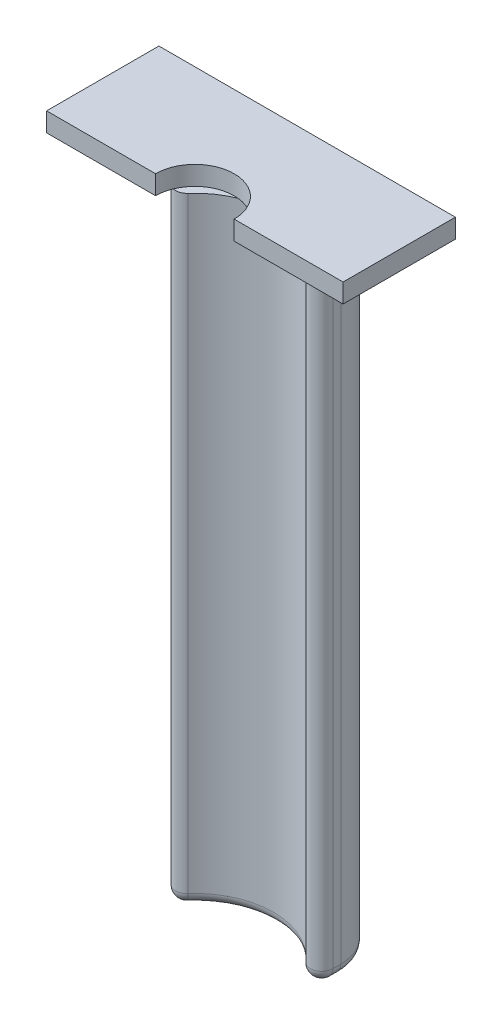
ISO-10303-21;
HEADER;
FILE_DESCRIPTION(('STEP AP214'),'2;1');
FILE_NAME('part.step','',(''),(''),'','','');
FILE_SCHEMA(('AUTOMOTIVE_DESIGN { 1 0 10303 214 1 1 1 1 }'));
ENDSEC;
DATA;
#1=APPLICATION_CONTEXT('core data for automotive mechanical design processes');
#2=APPLICATION_PROTOCOL_DEFINITION('international standard','automotive_design',2000,#1);
#3=PRODUCT_CONTEXT('',#1,'mechanical');
#4=PRODUCT('Part','Part','',(#3));
#5=PRODUCT_RELATED_PRODUCT_CATEGORY('part','',(#4));
#6=PRODUCT_DEFINITION_FORMATION('','',#4);
#7=PRODUCT_DEFINITION_CONTEXT('part definition',#1,'design');
#8=PRODUCT_DEFINITION('design','',#6,#7);
#9=PRODUCT_DEFINITION_SHAPE('','',#8);
#10=(LENGTH_UNIT() NAMED_UNIT(*) SI_UNIT(.MILLI.,.METRE.));
#11=(NAMED_UNIT(*) PLANE_ANGLE_UNIT() SI_UNIT($,.RADIAN.));
#12=(NAMED_UNIT(*) SI_UNIT($,.STERADIAN.) SOLID_ANGLE_UNIT());
#13=UNCERTAINTY_MEASURE_WITH_UNIT(LENGTH_MEASURE(1.E-05),#10,'distance_accuracy_value','');
#14=(GEOMETRIC_REPRESENTATION_CONTEXT(3) GLOBAL_UNCERTAINTY_ASSIGNED_CONTEXT((#13)) GLOBAL_UNIT_ASSIGNED_CONTEXT((#10,
#11,#12)) REPRESENTATION_CONTEXT('',''));
#15=CARTESIAN_POINT('',(0.,0.,0.));
#16=DIRECTION('',(0.,0.,1.));
#17=DIRECTION('',(1.,0.,0.));
#18=AXIS2_PLACEMENT_3D('',#15,#16,#17);
#19=CARTESIAN_POINT('',(0.,0.,10.));
#20=DIRECTION('',(0.,0.,-1.));
#21=DIRECTION('',(-1.,0.,0.));
#22=AXIS2_PLACEMENT_3D('',#19,#20,#21);
#23=PLANE('',#22);
#24=DIRECTION('',(1.,0.,0.));
#25=VECTOR('',#24,1.);
#26=CARTESIAN_POINT('',(0.,0.,10.));
#27=LINE('',#26,#25);
#28=CARTESIAN_POINT('',(0.,0.,10.));
#29=VERTEX_POINT('',#28);
#30=CARTESIAN_POINT('',(9.7,0.,10.));
#31=VERTEX_POINT('',#30);
#32=EDGE_CURVE('E509',#29,#31,#27,.T.);
#33=ORIENTED_EDGE('',*,*,#32,.T.);
#34=DIRECTION('',(0.,1.,0.));
#35=VECTOR('',#34,1.);
#36=CARTESIAN_POINT('',(9.7,-58.,10.));
#37=LINE('',#36,#35);
#38=CARTESIAN_POINT('',(9.7,1.7,10.));
#39=VERTEX_POINT('',#38);
#40=EDGE_CURVE('E11',#31,#39,#37,.T.);
#41=ORIENTED_EDGE('',*,*,#40,.T.);
#42=DIRECTION('',(-1.,0.,0.));
#43=VECTOR('',#42,1.);
#44=CARTESIAN_POINT('',(0.,1.7,10.));
#45=LINE('',#44,#43);
#46=CARTESIAN_POINT('',(0.,1.7,10.));
#47=VERTEX_POINT('',#46);
#48=EDGE_CURVE('E198',#39,#47,#45,.T.);
#49=ORIENTED_EDGE('',*,*,#48,.T.);
#50=DIRECTION('',(0.,-1.,0.));
#51=VECTOR('',#50,1.);
#52=CARTESIAN_POINT('',(0.,0.,10.));
#53=LINE('',#52,#51);
#54=EDGE_CURVE('E231',#47,#29,#53,.T.);
#55=ORIENTED_EDGE('',*,*,#54,.T.);
#56=EDGE_LOOP('',(#33,#41,#49,#55));
#57=FACE_BOUND('',#56,.T.);
#58=ADVANCED_FACE('F40',(#57),#23,.F.);
#59=CARTESIAN_POINT('',(0.,0.,10.));
#60=DIRECTION('',(0.,1.,0.));
#61=DIRECTION('',(0.,0.,1.));
#62=AXIS2_PLACEMENT_3D('',#59,#60,#61);
#63=PLANE('',#62);
#64=CARTESIAN_POINT('',(16.7,0.,10.));
#65=VERTEX_POINT('',#64);
#66=CARTESIAN_POINT('',(26.4,0.,10.));
#67=VERTEX_POINT('',#66);
#68=EDGE_CURVE('E508',#65,#67,#27,.T.);
#69=ORIENTED_EDGE('',*,*,#68,.F.);
#70=CARTESIAN_POINT('',(13.2,0.,10.));
#71=DIRECTION('',(0.,1.,0.));
#72=DIRECTION('',(0.,0.,1.));
#73=AXIS2_PLACEMENT_3D('',#70,#71,#72);
#74=CIRCLE('',#73,3.5);
#75=EDGE_CURVE('E56',#65,#31,#74,.T.);
#76=ORIENTED_EDGE('',*,*,#75,.T.);
#77=ORIENTED_EDGE('',*,*,#32,.F.);
#78=DIRECTION('',(0.,0.,-1.));
#79=VECTOR('',#78,1.);
#80=CARTESIAN_POINT('',(0.,0.,10.));
#81=LINE('',#80,#79);
#82=CARTESIAN_POINT('',(0.,0.,0.));
#83=VERTEX_POINT('',#82);
#84=EDGE_CURVE('E239',#29,#83,#81,.T.);
#85=ORIENTED_EDGE('',*,*,#84,.T.);
#86=DIRECTION('',(1.,0.,0.));
#87=VECTOR('',#86,1.);
#88=CARTESIAN_POINT('',(0.,0.,0.));
#89=LINE('',#88,#87);
#90=CARTESIAN_POINT('',(3.27179676972449,0.,0.));
#91=VERTEX_POINT('',#90);
#92=EDGE_CURVE('E222',#83,#91,#89,.T.);
#93=ORIENTED_EDGE('',*,*,#92,.T.);
#94=CARTESIAN_POINT('',(10.2,0.,4.));
#95=DIRECTION('',(0.,1.,0.));
#96=DIRECTION('',(0.,0.,1.));
#97=AXIS2_PLACEMENT_3D('',#94,#95,#96);
#98=CIRCLE('',#97,8.);
#99=CARTESIAN_POINT('',(2.78379079597067,0.,1.0000264931052));
#100=VERTEX_POINT('',#99);
#101=EDGE_CURVE('E277',#91,#100,#98,.T.);
#102=ORIENTED_EDGE('',*,*,#101,.T.);
#103=DIRECTION('',(-1.,0.,0.));
#104=VECTOR('',#103,1.);
#105=CARTESIAN_POINT('',(6.2,0.,1.0000264931052));
#106=LINE('',#105,#104);
#107=CARTESIAN_POINT('',(23.6162092040293,0.,1.0000264931052));
#108=VERTEX_POINT('',#107);
#109=EDGE_CURVE('E501',#108,#100,#106,.T.);
#110=ORIENTED_EDGE('',*,*,#109,.F.);
#111=CARTESIAN_POINT('',(16.2,0.,4.));
#112=DIRECTION('',(0.,1.,0.));
#113=DIRECTION('',(0.,0.,1.));
#114=AXIS2_PLACEMENT_3D('',#111,#112,#113);
#115=CIRCLE('',#114,8.);
#116=CARTESIAN_POINT('',(23.1282032302755,0.,0.));
#117=VERTEX_POINT('',#116);
#118=EDGE_CURVE('E281',#108,#117,#115,.T.);
#119=ORIENTED_EDGE('',*,*,#118,.T.);
#120=CARTESIAN_POINT('',(26.4,0.,0.));
#121=VERTEX_POINT('',#120);
#122=EDGE_CURVE('E220',#117,#121,#89,.T.);
#123=ORIENTED_EDGE('',*,*,#122,.T.);
#124=DIRECTION('',(0.,0.,-1.));
#125=VECTOR('',#124,1.);
#126=CARTESIAN_POINT('',(26.4,0.,10.));
#127=LINE('',#126,#125);
#128=EDGE_CURVE('E235',#67,#121,#127,.T.);
#129=ORIENTED_EDGE('',*,*,#128,.F.);
#130=EDGE_LOOP('',(#69,#76,#77,#85,#93,#102,#110,#119,#123,#129));
#131=FACE_BOUND('',#130,.T.);
#132=ADVANCED_FACE('F384',(#131),#63,.F.);
#133=CARTESIAN_POINT('',(0.,0.,10.));
#134=DIRECTION('',(1.,0.,0.));
#135=DIRECTION('',(0.,0.,-1.));
#136=AXIS2_PLACEMENT_3D('',#133,#134,#135);
#137=PLANE('',#136);
#138=DIRECTION('',(0.,-1.,0.));
#139=VECTOR('',#138,1.);
#140=CARTESIAN_POINT('',(0.,0.,0.));
#141=LINE('',#140,#139);
#142=CARTESIAN_POINT('',(0.,1.7,0.));
#143=VERTEX_POINT('',#142);
#144=EDGE_CURVE('E216',#143,#83,#141,.T.);
#145=ORIENTED_EDGE('',*,*,#144,.T.);
#146=ORIENTED_EDGE('',*,*,#84,.F.);
#147=ORIENTED_EDGE('',*,*,#54,.F.);
#148=DIRECTION('',(0.,0.,-1.));
#149=VECTOR('',#148,1.);
#150=CARTESIAN_POINT('',(0.,1.7,10.));
#151=LINE('',#150,#149);
#152=EDGE_CURVE('E206',#47,#143,#151,.T.);
#153=ORIENTED_EDGE('',*,*,#152,.T.);
#154=EDGE_LOOP('',(#145,#146,#147,#153));
#155=FACE_BOUND('',#154,.T.);
#156=ADVANCED_FACE('F390',(#155),#137,.F.);
#157=CARTESIAN_POINT('',(26.4,0.,10.));
#158=DIRECTION('',(-1.,0.,0.));
#159=DIRECTION('',(0.,0.,1.));
#160=AXIS2_PLACEMENT_3D('',#157,#158,#159);
#161=PLANE('',#160);
#162=DIRECTION('',(0.,1.,0.));
#163=VECTOR('',#162,1.);
#164=CARTESIAN_POINT('',(26.4,0.,0.));
#165=LINE('',#164,#163);
#166=CARTESIAN_POINT('',(26.4,1.7,0.));
#167=VERTEX_POINT('',#166);
#168=EDGE_CURVE('E226',#121,#167,#165,.T.);
#169=ORIENTED_EDGE('',*,*,#168,.T.);
#170=DIRECTION('',(0.,0.,-1.));
#171=VECTOR('',#170,1.);
#172=CARTESIAN_POINT('',(26.4,1.7,10.));
#173=LINE('',#172,#171);
#174=CARTESIAN_POINT('',(26.4,1.7,10.));
#175=VERTEX_POINT('',#174);
#176=EDGE_CURVE('E211',#175,#167,#173,.T.);
#177=ORIENTED_EDGE('',*,*,#176,.F.);
#178=DIRECTION('',(0.,1.,0.));
#179=VECTOR('',#178,1.);
#180=CARTESIAN_POINT('',(26.4,0.,10.));
#181=LINE('',#180,#179);
#182=EDGE_CURVE('E203',#67,#175,#181,.T.);
#183=ORIENTED_EDGE('',*,*,#182,.F.);
#184=ORIENTED_EDGE('',*,*,#128,.T.);
#185=EDGE_LOOP('',(#169,#177,#183,#184));
#186=FACE_BOUND('',#185,.T.);
#187=ADVANCED_FACE('F399',(#186),#161,.F.);
#188=CARTESIAN_POINT('',(0.,1.7,10.));
#189=DIRECTION('',(0.,-1.,0.));
#190=DIRECTION('',(0.,0.,-1.));
#191=AXIS2_PLACEMENT_3D('',#188,#189,#190);
#192=PLANE('',#191);
#193=ORIENTED_EDGE('',*,*,#48,.F.);
#194=CARTESIAN_POINT('',(13.2,1.7,10.));
#195=DIRECTION('',(0.,1.,0.));
#196=DIRECTION('',(0.,0.,1.));
#197=AXIS2_PLACEMENT_3D('',#194,#195,#196);
#198=CIRCLE('',#197,3.5);
#199=CARTESIAN_POINT('',(16.7,1.7,10.));
#200=VERTEX_POINT('',#199);
#201=EDGE_CURVE('E185',#200,#39,#198,.T.);
#202=ORIENTED_EDGE('',*,*,#201,.F.);
#203=EDGE_CURVE('E196',#175,#200,#45,.T.);
#204=ORIENTED_EDGE('',*,*,#203,.F.);
#205=ORIENTED_EDGE('',*,*,#176,.T.);
#206=DIRECTION('',(-1.,0.,0.));
#207=VECTOR('',#206,1.);
#208=CARTESIAN_POINT('',(0.,1.7,0.));
#209=LINE('',#208,#207);
#210=EDGE_CURVE('E229',#167,#143,#209,.T.);
#211=ORIENTED_EDGE('',*,*,#210,.T.);
#212=ORIENTED_EDGE('',*,*,#152,.F.);
#213=EDGE_LOOP('',(#193,#202,#204,#205,#211,#212));
#214=FACE_BOUND('',#213,.T.);
#215=ADVANCED_FACE('F194',(#214),#192,.F.);
#216=ORIENTED_EDGE('',*,*,#203,.T.);
#217=DIRECTION('',(0.,1.,0.));
#218=VECTOR('',#217,1.);
#219=CARTESIAN_POINT('',(16.7,-58.,10.));
#220=LINE('',#219,#218);
#221=EDGE_CURVE('E49',#200,#65,#220,.F.);
#222=ORIENTED_EDGE('',*,*,#221,.T.);
#223=ORIENTED_EDGE('',*,*,#68,.T.);
#224=ORIENTED_EDGE('',*,*,#182,.T.);
#225=EDGE_LOOP('',(#216,#222,#223,#224));
#226=FACE_BOUND('',#225,.T.);
#227=ADVANCED_FACE('F201',(#226),#23,.F.);
#228=CARTESIAN_POINT('',(0.,0.,0.));
#229=DIRECTION('',(0.,0.,-1.));
#230=DIRECTION('',(-1.,0.,0.));
#231=AXIS2_PLACEMENT_3D('',#228,#229,#230);
#232=PLANE('',#231);
#233=DIRECTION('',(0.,1.,0.));
#234=VECTOR('',#233,1.);
#235=CARTESIAN_POINT('',(16.2,-58.,0.));
#236=LINE('',#235,#234);
#237=CARTESIAN_POINT('',(16.2,-4.,0.));
#238=VERTEX_POINT('',#237);
#239=CARTESIAN_POINT('',(16.2,-57.,0.));
#240=VERTEX_POINT('',#239);
#241=EDGE_CURVE('E270',#238,#240,#236,.F.);
#242=ORIENTED_EDGE('',*,*,#241,.T.);
#243=DIRECTION('',(1.,0.,0.));
#244=VECTOR('',#243,1.);
#245=CARTESIAN_POINT('',(0.,-57.,0.));
#246=LINE('',#245,#244);
#247=CARTESIAN_POINT('',(10.2,-57.,0.));
#248=VERTEX_POINT('',#247);
#249=EDGE_CURVE('E190',#240,#248,#246,.F.);
#250=ORIENTED_EDGE('',*,*,#249,.T.);
#251=DIRECTION('',(0.,1.,0.));
#252=VECTOR('',#251,1.);
#253=CARTESIAN_POINT('',(10.2,0.,0.));
#254=LINE('',#253,#252);
#255=CARTESIAN_POINT('',(10.2,-4.,0.));
#256=VERTEX_POINT('',#255);
#257=EDGE_CURVE('E267',#248,#256,#254,.T.);
#258=ORIENTED_EDGE('',*,*,#257,.T.);
#259=CARTESIAN_POINT('',(3.27179676972449,0.,0.));
#260=CARTESIAN_POINT('',(3.44318740382075,2.3757210775233E-05,0.));
#261=CARTESIAN_POINT('',(3.61447794935872,-0.0082578547366063,0.));
#262=CARTESIAN_POINT('',(3.95535815549959,-0.0402941713150807,0.));
#263=CARTESIAN_POINT('',(4.12495000635247,-0.0640253291150302,0.));
#264=CARTESIAN_POINT('',(4.45943389154686,-0.125457538262513,0.));
#265=CARTESIAN_POINT('',(4.62435793170057,-0.162986849639074,0.));
#266=CARTESIAN_POINT('',(4.95080234194004,-0.25087788643673,0.));
#267=CARTESIAN_POINT('',(5.11232104613848,-0.301245741670157,0.));
#268=CARTESIAN_POINT('',(5.49058875073115,-0.434512302334383,0.));
#269=CARTESIAN_POINT('',(5.70553536395276,-0.522542648624137,0.));
#270=CARTESIAN_POINT('',(6.12672082413843,-0.717349162369902,0.));
#271=CARTESIAN_POINT('',(6.33295700838357,-0.824131011312194,0.));
#272=CARTESIAN_POINT('',(6.73740431677205,-1.05393922273429,0.));
#273=CARTESIAN_POINT('',(6.93557241809557,-1.17704071935888,0.));
#274=CARTESIAN_POINT('',(7.32327058637973,-1.43625002558701,0.));
#275=CARTESIAN_POINT('',(7.51279664596624,-1.57236378027297,0.));
#276=CARTESIAN_POINT('',(8.14662058674845,-2.05483157478887,0.));
#277=CARTESIAN_POINT('',(8.57180901734936,-2.4260596530431,0.));
#278=CARTESIAN_POINT('',(9.39502283195022,-3.1951894009338,0.));
#279=CARTESIAN_POINT('',(9.79306897501043,-3.59307021352641,0.));
#280=CARTESIAN_POINT('',(10.1940371497967,-3.99403715178295,0.));
#281=CARTESIAN_POINT('',(10.1970185737604,-3.99701857576173,0.));
#282=CARTESIAN_POINT('',(10.2,-4.,0.));
#283=B_SPLINE_CURVE_WITH_KNOTS('',3,(#259,#260,#261,#262,#263,#264,#265,#266,#267,#268,#269,
#270,#271,#272,#273,#274,#275,#276,#277,#278,#279,#280,#281,#282),.UNSPECIFIED.,.F.,.F.,(4,2,2,
2,2,2,2,2,2,2,2,4),(0.,0.513825328055995,1.02686935660983,1.53373272415263,2.04083855036094,
2.73656004201664,3.43249269401187,4.13174848318381,4.83132529150025,6.5211454317345,
8.20965831535387,8.22230742599459),.UNSPECIFIED.);
#284=EDGE_CURVE('E324',#256,#91,#283,.F.);
#285=ORIENTED_EDGE('',*,*,#284,.T.);
#286=ORIENTED_EDGE('',*,*,#92,.F.);
#287=ORIENTED_EDGE('',*,*,#144,.F.);
#288=ORIENTED_EDGE('',*,*,#210,.F.);
#289=ORIENTED_EDGE('',*,*,#168,.F.);
#290=ORIENTED_EDGE('',*,*,#122,.F.);
#291=CARTESIAN_POINT('',(23.1282032302755,0.,0.));
#292=CARTESIAN_POINT('',(22.9568125961793,2.37572107752989E-05,0.));
#293=CARTESIAN_POINT('',(22.7855220506413,-0.00825785473660565,0.));
#294=CARTESIAN_POINT('',(22.4446418445004,-0.0402941713150781,0.));
#295=CARTESIAN_POINT('',(22.2750499936476,-0.0640253291150263,0.));
#296=CARTESIAN_POINT('',(21.9405661084532,-0.125457538262508,0.));
#297=CARTESIAN_POINT('',(21.7756420682995,-0.16298684963907,0.));
#298=CARTESIAN_POINT('',(21.44919765806,-0.250877886436728,0.));
#299=CARTESIAN_POINT('',(21.2876789538615,-0.301245741670155,0.));
#300=CARTESIAN_POINT('',(20.9094112492688,-0.434512302334383,0.));
#301=CARTESIAN_POINT('',(20.6944646360472,-0.522542648624141,0.));
#302=CARTESIAN_POINT('',(20.2732791758616,-0.717349162369911,0.));
#303=CARTESIAN_POINT('',(20.0670429916164,-0.824131011312204,0.));
#304=CARTESIAN_POINT('',(19.6625956832279,-1.0539392227343,0.));
#305=CARTESIAN_POINT('',(19.4644275819044,-1.17704071935889,0.));
#306=CARTESIAN_POINT('',(19.0767294136203,-1.43625002558702,0.));
#307=CARTESIAN_POINT('',(18.8872033540338,-1.57236378027297,0.));
#308=CARTESIAN_POINT('',(18.2533794132515,-2.05483157478886,0.));
#309=CARTESIAN_POINT('',(17.8281909826506,-2.42605965304302,0.));
#310=CARTESIAN_POINT('',(17.0049771680499,-3.19518940093386,0.));
#311=CARTESIAN_POINT('',(16.6069310249899,-3.59307021352668,0.));
#312=CARTESIAN_POINT('',(16.2059628502034,-3.99403715178295,0.));
#313=CARTESIAN_POINT('',(16.2029814262396,-3.99701857576173,0.));
#314=CARTESIAN_POINT('',(16.2,-4.,0.));
#315=B_SPLINE_CURVE_WITH_KNOTS('',3,(#291,#292,#293,#294,#295,#296,#297,#298,#299,#300,#301,
#302,#303,#304,#305,#306,#307,#308,#309,#310,#311,#312,#313,#314),.UNSPECIFIED.,.F.,.F.,(4,2,2,
2,2,2,2,2,2,2,2,4),(0.,0.51382532805598,1.0268693566098,1.53373272415262,2.04083855036094,
2.73656004201665,3.4324926940119,4.13174848318382,4.83132529150025,6.52114543173449,
8.20965831535386,8.22230742599459),.UNSPECIFIED.);
#316=EDGE_CURVE('E293',#117,#238,#315,.T.);
#317=ORIENTED_EDGE('',*,*,#316,.T.);
#318=EDGE_LOOP('',(#242,#250,#258,#285,#286,#287,#288,#289,#290,#317));
#319=FACE_BOUND('',#318,.T.);
#320=ADVANCED_FACE('F313',(#319),#232,.T.);
#321=CARTESIAN_POINT('',(6.2,-3.,1.0000264931052));
#322=DIRECTION('',(1.,0.,0.));
#323=DIRECTION('',(0.,0.,-1.));
#324=AXIS2_PLACEMENT_3D('',#321,#322,#323);
#325=PLANE('',#324);
#326=DIRECTION('',(0.,1.,0.));
#327=VECTOR('',#326,1.);
#328=CARTESIAN_POINT('',(6.2,-58.,4.));
#329=LINE('',#328,#327);
#330=CARTESIAN_POINT('',(6.2,-4.,4.));
#331=VERTEX_POINT('',#330);
#332=CARTESIAN_POINT('',(6.2,-57.,4.));
#333=VERTEX_POINT('',#332);
#334=EDGE_CURVE('E273',#331,#333,#329,.F.);
#335=ORIENTED_EDGE('',*,*,#334,.T.);
#336=DIRECTION('',(0.,0.,-1.));
#337=VECTOR('',#336,1.);
#338=CARTESIAN_POINT('',(6.2,-57.,4.7084973778708));
#339=LINE('',#338,#337);
#340=CARTESIAN_POINT('',(6.2,-57.,4.7084973778708));
#341=VERTEX_POINT('',#340);
#342=EDGE_CURVE('E444',#333,#341,#339,.F.);
#343=ORIENTED_EDGE('',*,*,#342,.T.);
#344=DIRECTION('',(0.,1.,0.));
#345=VECTOR('',#344,1.);
#346=CARTESIAN_POINT('',(6.2,-3.,4.7084973778708));
#347=LINE('',#346,#345);
#348=CARTESIAN_POINT('',(6.2,-3.,4.7084973778708));
#349=VERTEX_POINT('',#348);
#350=EDGE_CURVE('E261',#341,#349,#347,.T.);
#351=ORIENTED_EDGE('',*,*,#350,.T.);
#352=DIRECTION('',(0.,0.,-1.));
#353=VECTOR('',#352,1.);
#354=CARTESIAN_POINT('',(6.2,-3.,10.));
#355=LINE('',#354,#353);
#356=CARTESIAN_POINT('',(6.2,-3.,2.98399485203117));
#357=VERTEX_POINT('',#356);
#358=EDGE_CURVE('E490',#349,#357,#355,.T.);
#359=ORIENTED_EDGE('',*,*,#358,.T.);
#360=CARTESIAN_POINT('',(6.2,-3.,2.98399485203117));
#361=CARTESIAN_POINT('',(6.2,-3.16252438683973,3.15445092972594));
#362=CARTESIAN_POINT('',(6.2,-3.32703336535288,3.32296088164243));
#363=CARTESIAN_POINT('',(6.2,-3.65804216909892,3.65800600244265));
#364=CARTESIAN_POINT('',(6.2,-3.82454190011382,3.82454126404702));
#365=CARTESIAN_POINT('',(6.2,-3.99403715314872,3.99403715316251));
#366=CARTESIAN_POINT('',(6.2,-3.99701857714118,3.99701857715331));
#367=CARTESIAN_POINT('',(6.2,-4.,4.));
#368=B_SPLINE_CURVE_WITH_KNOTS('',3,(#360,#361,#362,#363,#364,#365,#366,#367),.UNSPECIFIED.,.F.,
.F.,(4,2,2,4),(0.,0.706492736666649,1.41295216788592,1.4256012785267),.UNSPECIFIED.);
#369=EDGE_CURVE('E333',#357,#331,#368,.T.);
#370=ORIENTED_EDGE('',*,*,#369,.T.);
#371=EDGE_LOOP('',(#335,#343,#351,#359,#370));
#372=FACE_BOUND('',#371,.T.);
#373=ADVANCED_FACE('F318',(#372),#325,.F.);
#374=CARTESIAN_POINT('',(20.2,-3.,1.0000264931052));
#375=DIRECTION('',(-1.,0.,0.));
#376=DIRECTION('',(0.,0.,1.));
#377=AXIS2_PLACEMENT_3D('',#374,#375,#376);
#378=PLANE('',#377);
#379=DIRECTION('',(0.,1.,0.));
#380=VECTOR('',#379,1.);
#381=CARTESIAN_POINT('',(20.2,-3.,4.7084973778708));
#382=LINE('',#381,#380);
#383=CARTESIAN_POINT('',(20.2,-3.,4.7084973778708));
#384=VERTEX_POINT('',#383);
#385=CARTESIAN_POINT('',(20.2,-57.,4.7084973778708));
#386=VERTEX_POINT('',#385);
#387=EDGE_CURVE('E257',#384,#386,#382,.F.);
#388=ORIENTED_EDGE('',*,*,#387,.T.);
#389=DIRECTION('',(0.,0.,1.));
#390=VECTOR('',#389,1.);
#391=CARTESIAN_POINT('',(20.2,-57.,4.));
#392=LINE('',#391,#390);
#393=CARTESIAN_POINT('',(20.2,-57.,4.));
#394=VERTEX_POINT('',#393);
#395=EDGE_CURVE('E567',#386,#394,#392,.F.);
#396=ORIENTED_EDGE('',*,*,#395,.T.);
#397=DIRECTION('',(0.,1.,0.));
#398=VECTOR('',#397,1.);
#399=CARTESIAN_POINT('',(20.2,0.,4.));
#400=LINE('',#399,#398);
#401=CARTESIAN_POINT('',(20.2,-4.,4.));
#402=VERTEX_POINT('',#401);
#403=EDGE_CURVE('E264',#394,#402,#400,.T.);
#404=ORIENTED_EDGE('',*,*,#403,.T.);
#405=CARTESIAN_POINT('',(20.2,-3.,2.98399485203117));
#406=CARTESIAN_POINT('',(20.2,-3.16252438683973,3.15445092972594));
#407=CARTESIAN_POINT('',(20.2,-3.32703336535288,3.32296088164243));
#408=CARTESIAN_POINT('',(20.2,-3.65804216909892,3.65800600244265));
#409=CARTESIAN_POINT('',(20.2,-3.82454190011382,3.82454126404702));
#410=CARTESIAN_POINT('',(20.2,-3.99403715314872,3.99403715316251));
#411=CARTESIAN_POINT('',(20.2,-3.99701857714118,3.99701857715331));
#412=CARTESIAN_POINT('',(20.2,-4.,4.));
#413=B_SPLINE_CURVE_WITH_KNOTS('',3,(#405,#406,#407,#408,#409,#410,#411,#412),.UNSPECIFIED.,.F.,
.F.,(4,2,2,4),(0.,0.706492736666649,1.41295216788592,1.4256012785267),.UNSPECIFIED.);
#414=CARTESIAN_POINT('',(20.2,-3.,2.98399485203117));
#415=VERTEX_POINT('',#414);
#416=EDGE_CURVE('E302',#402,#415,#413,.F.);
#417=ORIENTED_EDGE('',*,*,#416,.T.);
#418=DIRECTION('',(0.,0.,1.));
#419=VECTOR('',#418,1.);
#420=CARTESIAN_POINT('',(20.2,-3.,0.));
#421=LINE('',#420,#419);
#422=EDGE_CURVE('E496',#415,#384,#421,.T.);
#423=ORIENTED_EDGE('',*,*,#422,.T.);
#424=EDGE_LOOP('',(#388,#396,#404,#417,#423));
#425=FACE_BOUND('',#424,.T.);
#426=ADVANCED_FACE('F370',(#425),#378,.F.);
#427=CARTESIAN_POINT('',(6.2,-3.,1.0000264931052));
#428=DIRECTION('',(0.,0.,-1.));
#429=DIRECTION('',(-1.,0.,0.));
#430=AXIS2_PLACEMENT_3D('',#427,#428,#429);
#431=PLANE('',#430);
#432=DIRECTION('',(-1.,0.,0.));
#433=VECTOR('',#432,1.);
#434=CARTESIAN_POINT('',(6.2,-3.,1.0000264931052));
#435=LINE('',#434,#433);
#436=CARTESIAN_POINT('',(19.0341533865708,-3.,1.0000264931052));
#437=VERTEX_POINT('',#436);
#438=CARTESIAN_POINT('',(7.36584661342922,-3.,1.0000264931052));
#439=VERTEX_POINT('',#438);
#440=EDGE_CURVE('E221',#437,#439,#435,.T.);
#441=ORIENTED_EDGE('',*,*,#440,.F.);
#442=CARTESIAN_POINT('',(19.0341533865708,-3.,1.0000264931052));
#443=CARTESIAN_POINT('',(19.0770445291421,-2.88602225699738,1.0000264931052));
#444=CARTESIAN_POINT('',(19.1262124281104,-2.77457680230124,1.0000264931052));
#445=CARTESIAN_POINT('',(19.2352426944257,-2.55732951738061,1.0000264931052));
#446=CARTESIAN_POINT('',(19.2950810805956,-2.45151570890776,1.0000264931052));
#447=CARTESIAN_POINT('',(19.4234683367068,-2.24613100681048,1.0000264931052));
#448=CARTESIAN_POINT('',(19.4919708527992,-2.1465308195784,1.0000264931052));
#449=CARTESIAN_POINT('',(19.636730928486,-1.95304441461767,1.0000264931052));
#450=CARTESIAN_POINT('',(19.7129942885713,-1.85916255581738,1.0000264931052));
#451=CARTESIAN_POINT('',(19.8890321504135,-1.65817937061081,1.0000264931052));
#452=CARTESIAN_POINT('',(19.9903772952475,-1.55245283683828,1.0000264931052));
#453=CARTESIAN_POINT('',(20.2017061363696,-1.34993073469195,1.0000264931052));
#454=CARTESIAN_POINT('',(20.3116945849327,-1.25314014399848,1.0000264931052));
#455=CARTESIAN_POINT('',(20.5396249234514,-1.06866915633147,1.0000264931052));
#456=CARTESIAN_POINT('',(20.6575904221601,-0.981017944568903,1.0000264931052));
#457=CARTESIAN_POINT('',(20.9003025321786,-0.815690010901454,1.0000264931052));
#458=CARTESIAN_POINT('',(21.0250486821742,-0.738012611645081,1.0000264931052));
#459=CARTESIAN_POINT('',(21.2811452002362,-0.592864423187637,1.0000264931052));
#460=CARTESIAN_POINT('',(21.412524515482,-0.525444660848858,1.0000264931052));
#461=CARTESIAN_POINT('',(21.6804504921685,-0.401932017598027,1.0000264931052));
#462=CARTESIAN_POINT('',(21.8169951700335,-0.345834840038013,1.0000264931052));
#463=CARTESIAN_POINT('',(22.0940188237115,-0.24573667326621,1.0000264931052));
#464=CARTESIAN_POINT('',(22.2344855528572,-0.201701853502277,1.0000264931052));
#465=CARTESIAN_POINT('',(22.5186929350934,-0.126169898580577,1.0000264931052));
#466=CARTESIAN_POINT('',(22.6624320267285,-0.0946669109595983,1.0000264931052));
#467=CARTESIAN_POINT('',(22.9408041256241,-0.0467173424781422,1.0000264931052));
#468=CARTESIAN_POINT('',(23.0752670699152,-0.0292836137151907,1.0000264931052));
#469=CARTESIAN_POINT('',(23.3452118952358,-0.0059172145215817,1.0000264931052));
#470=CARTESIAN_POINT('',(23.4806939778216,1.31174542787102E-05,1.0000264931052));
#471=CARTESIAN_POINT('',(23.6162092040293,0.,1.0000264931052));
#472=B_SPLINE_CURVE_WITH_KNOTS('',3,(#442,#443,#444,#445,#446,#447,#448,#449,#450,#451,#452,
#453,#454,#455,#456,#457,#458,#459,#460,#461,#462,#463,#464,#465,#466,#467,#468,#469,#470,#471),
.UNSPECIFIED.,.F.,.F.,(4,2,2,2,2,2,2,2,2,2,2,2,2,2,4),(0.,0.364924222847271,0.729038409615402,
1.09128100822632,1.45379636532787,1.89258759411499,2.3316217908565,2.77201760184683,
3.21238348840102,3.65487299845965,4.09719427740856,4.53826199900118,4.97912349603044,
5.38540573522609,5.79177055638806),.UNSPECIFIED.);
#473=EDGE_CURVE('E360',#437,#108,#472,.T.);
#474=ORIENTED_EDGE('',*,*,#473,.T.);
#475=ORIENTED_EDGE('',*,*,#109,.T.);
#476=CARTESIAN_POINT('',(2.78379079597067,0.,1.0000264931052));
#477=CARTESIAN_POINT('',(2.92312446060093,1.44945313344448E-05,1.0000264931052));
#478=CARTESIAN_POINT('',(3.06242370896496,-0.0062554767865494,1.0000264931052));
#479=CARTESIAN_POINT('',(3.33986991222149,-0.030943371829517,1.0000264931052));
#480=CARTESIAN_POINT('',(3.47801745238964,-0.0493546894436414,1.0000264931052));
#481=CARTESIAN_POINT('',(3.75141017467743,-0.0977599500929608,1.0000264931052));
#482=CARTESIAN_POINT('',(3.88666777629275,-0.127683936576668,1.0000264931052));
#483=CARTESIAN_POINT('',(4.15422611933089,-0.19861436930512,1.0000264931052));
#484=CARTESIAN_POINT('',(4.28652650592176,-0.239622137830024,1.0000264931052));
#485=CARTESIAN_POINT('',(4.67720438278803,-0.378307999163605,1.0000264931052));
#486=CARTESIAN_POINT('',(4.93012938046737,-0.491789150860512,1.0000264931052));
#487=CARTESIAN_POINT('',(5.41616594010802,-0.75703320782897,1.0000264931052));
#488=CARTESIAN_POINT('',(5.64920088656661,-0.908935931350022,1.0000264931052));
#489=CARTESIAN_POINT('',(5.98736310009281,-1.16878284597336,1.0000264931052));
#490=CARTESIAN_POINT('',(6.10191301306791,-1.26468954138375,1.0000264931052));
#491=CARTESIAN_POINT('',(6.32245634020531,-1.46602022230281,1.0000264931052));
#492=CARTESIAN_POINT('',(6.42844674914238,-1.57144752319531,1.0000264931052));
#493=CARTESIAN_POINT('',(6.63004089995872,-1.79087991183298,1.0000264931052));
#494=CARTESIAN_POINT('',(6.72569245804346,-1.90484098506294,1.0000264931052));
#495=CARTESIAN_POINT('',(6.90543222097551,-2.14144822848626,1.0000264931052));
#496=CARTESIAN_POINT('',(6.9895313665193,-2.26408601226458,1.0000264931052));
#497=CARTESIAN_POINT('',(7.1255171346989,-2.48763895104421,1.0000264931052));
#498=CARTESIAN_POINT('',(7.1803074981377,-2.58678148993288,1.0000264931052));
#499=CARTESIAN_POINT('',(7.28050944058679,-2.78987828666691,1.0000264931052));
#500=CARTESIAN_POINT('',(7.32590568118564,-2.89384007977197,1.0000264931052));
#501=CARTESIAN_POINT('',(7.36584661342922,-3.,1.0000264931052));
#502=B_SPLINE_CURVE_WITH_KNOTS('',3,(#476,#477,#478,#479,#480,#481,#482,#483,#484,#485,#486,
#487,#488,#489,#490,#491,#492,#493,#494,#495,#496,#497,#498,#499,#500,#501),.UNSPECIFIED.,.F.,
.F.,(4,2,2,2,2,2,2,2,2,2,2,2,4),(0.,0.417808080513758,0.835389018856418,1.25047161832227,
1.66560375845239,2.49354570180297,3.32454504498226,3.77228200165299,4.22017548057648,
4.66589983316553,5.11119910917955,5.4505669005643,5.79048450288763),.UNSPECIFIED.);
#503=EDGE_CURVE('E350',#100,#439,#502,.T.);
#504=ORIENTED_EDGE('',*,*,#503,.T.);
#505=EDGE_LOOP('',(#441,#474,#475,#504));
#506=FACE_BOUND('',#505,.T.);
#507=ADVANCED_FACE('F365',(#506),#431,.F.);
#508=CARTESIAN_POINT('',(13.2,-3.,10.));
#509=DIRECTION('',(0.,-1.,0.));
#510=DIRECTION('',(0.,0.,-1.));
#511=AXIS2_PLACEMENT_3D('',#508,#509,#510);
#512=PLANE('',#511);
#513=ORIENTED_EDGE('',*,*,#422,.F.);
#514=CARTESIAN_POINT('',(16.2,-3.,4.));
#515=DIRECTION('',(0.,1.,0.));
#516=DIRECTION('',(0.,0.,1.));
#517=AXIS2_PLACEMENT_3D('',#514,#515,#516);
#518=CIRCLE('',#517,4.12701665379474);
#519=EDGE_CURVE('E535',#415,#437,#518,.T.);
#520=ORIENTED_EDGE('',*,*,#519,.T.);
#521=ORIENTED_EDGE('',*,*,#440,.T.);
#522=CARTESIAN_POINT('',(10.2,-3.,4.));
#523=DIRECTION('',(0.,1.,0.));
#524=DIRECTION('',(0.,0.,1.));
#525=AXIS2_PLACEMENT_3D('',#522,#523,#524);
#526=CIRCLE('',#525,4.12701665379258);
#527=EDGE_CURVE('E359',#439,#357,#526,.T.);
#528=ORIENTED_EDGE('',*,*,#527,.T.);
#529=ORIENTED_EDGE('',*,*,#358,.F.);
#530=CARTESIAN_POINT('',(7.2,-3.,4.7084973778708));
#531=DIRECTION('',(0.,-1.,0.));
#532=DIRECTION('',(0.,0.,-1.));
#533=AXIS2_PLACEMENT_3D('',#530,#531,#532);
#534=CIRCLE('',#533,1.);
#535=CARTESIAN_POINT('',(7.95,-3.,5.36993520563694));
#536=VERTEX_POINT('',#535);
#537=EDGE_CURVE('E250',#349,#536,#534,.F.);
#538=ORIENTED_EDGE('',*,*,#537,.T.);
#539=CARTESIAN_POINT('',(13.2,-3.,10.));
#540=DIRECTION('',(0.,1.,0.));
#541=DIRECTION('',(0.,0.,-1.));
#542=AXIS2_PLACEMENT_3D('',#539,#540,#541);
#543=CIRCLE('',#542,7.00000000000001);
#544=CARTESIAN_POINT('',(18.45,-3.,5.36993520563694));
#545=VERTEX_POINT('',#544);
#546=EDGE_CURVE('E483',#545,#536,#543,.T.);
#547=ORIENTED_EDGE('',*,*,#546,.F.);
#548=CARTESIAN_POINT('',(19.2,-3.,4.7084973778708));
#549=DIRECTION('',(0.,-1.,0.));
#550=DIRECTION('',(0.,0.,-1.));
#551=AXIS2_PLACEMENT_3D('',#548,#549,#550);
#552=CIRCLE('',#551,1.);
#553=EDGE_CURVE('E253',#545,#384,#552,.F.);
#554=ORIENTED_EDGE('',*,*,#553,.T.);
#555=EDGE_LOOP('',(#513,#520,#521,#528,#529,#538,#547,#554));
#556=FACE_BOUND('',#555,.T.);
#557=ADVANCED_FACE('F369',(#556),#512,.F.);
#558=CARTESIAN_POINT('',(13.2,-58.,10.));
#559=DIRECTION('',(0.,1.,0.));
#560=DIRECTION('',(0.,0.,1.));
#561=AXIS2_PLACEMENT_3D('',#558,#559,#560);
#562=CYLINDRICAL_SURFACE('',#561,7.00000000000001);
#563=DIRECTION('',(0.,1.,0.));
#564=VECTOR('',#563,1.);
#565=CARTESIAN_POINT('',(7.95,-58.,5.36993520563694));
#566=LINE('',#565,#564);
#567=CARTESIAN_POINT('',(7.95,-57.,5.36993520563694));
#568=VERTEX_POINT('',#567);
#569=EDGE_CURVE('E243',#536,#568,#566,.F.);
#570=ORIENTED_EDGE('',*,*,#569,.T.);
#571=CARTESIAN_POINT('',(13.2,-57.,10.));
#572=DIRECTION('',(0.,-1.,0.));
#573=DIRECTION('',(0.,0.,-1.));
#574=AXIS2_PLACEMENT_3D('',#571,#572,#573);
#575=CIRCLE('',#574,7.00000000000001);
#576=CARTESIAN_POINT('',(18.45,-57.,5.36993520563694));
#577=VERTEX_POINT('',#576);
#578=EDGE_CURVE('E561',#568,#577,#575,.T.);
#579=ORIENTED_EDGE('',*,*,#578,.T.);
#580=DIRECTION('',(0.,1.,0.));
#581=VECTOR('',#580,1.);
#582=CARTESIAN_POINT('',(18.45,-58.,5.36993520563694));
#583=LINE('',#582,#581);
#584=EDGE_CURVE('E247',#577,#545,#583,.T.);
#585=ORIENTED_EDGE('',*,*,#584,.T.);
#586=ORIENTED_EDGE('',*,*,#546,.T.);
#587=EDGE_LOOP('',(#570,#579,#585,#586));
#588=FACE_BOUND('',#587,.T.);
#589=ADVANCED_FACE('F372',(#588),#562,.F.);
#590=CARTESIAN_POINT('',(13.2,-58.,10.));
#591=DIRECTION('',(0.,-1.,0.));
#592=DIRECTION('',(0.,0.,-1.));
#593=AXIS2_PLACEMENT_3D('',#590,#591,#592);
#594=PLANE('',#593);
#595=DIRECTION('',(0.,0.,-1.));
#596=VECTOR('',#595,1.);
#597=CARTESIAN_POINT('',(7.2,-58.,4.));
#598=LINE('',#597,#596);
#599=CARTESIAN_POINT('',(7.2,-58.,4.7084973778708));
#600=VERTEX_POINT('',#599);
#601=CARTESIAN_POINT('',(7.2,-58.,4.));
#602=VERTEX_POINT('',#601);
#603=EDGE_CURVE('E551',#600,#602,#598,.T.);
#604=ORIENTED_EDGE('',*,*,#603,.T.);
#605=CARTESIAN_POINT('',(10.2,-58.,4.));
#606=DIRECTION('',(0.,-1.,0.));
#607=DIRECTION('',(0.,0.,-1.));
#608=AXIS2_PLACEMENT_3D('',#605,#606,#607);
#609=CIRCLE('',#608,3.);
#610=CARTESIAN_POINT('',(10.2,-58.,0.999999999999999));
#611=VERTEX_POINT('',#610);
#612=EDGE_CURVE('E445',#602,#611,#609,.T.);
#613=ORIENTED_EDGE('',*,*,#612,.T.);
#614=DIRECTION('',(1.,0.,0.));
#615=VECTOR('',#614,1.);
#616=CARTESIAN_POINT('',(13.2,-58.,0.999999999999999));
#617=LINE('',#616,#615);
#618=CARTESIAN_POINT('',(16.2,-58.,0.999999999999999));
#619=VERTEX_POINT('',#618);
#620=EDGE_CURVE('E332',#611,#619,#617,.T.);
#621=ORIENTED_EDGE('',*,*,#620,.T.);
#622=CARTESIAN_POINT('',(16.2,-58.,4.));
#623=DIRECTION('',(0.,-1.,0.));
#624=DIRECTION('',(0.,0.,-1.));
#625=AXIS2_PLACEMENT_3D('',#622,#623,#624);
#626=CIRCLE('',#625,3.);
#627=CARTESIAN_POINT('',(19.2,-58.,4.));
#628=VERTEX_POINT('',#627);
#629=EDGE_CURVE('E544',#619,#628,#626,.T.);
#630=ORIENTED_EDGE('',*,*,#629,.T.);
#631=DIRECTION('',(0.,0.,1.));
#632=VECTOR('',#631,1.);
#633=CARTESIAN_POINT('',(19.2,-58.,4.7084973778708));
#634=LINE('',#633,#632);
#635=CARTESIAN_POINT('',(19.2,-58.,4.7084973778708));
#636=VERTEX_POINT('',#635);
#637=EDGE_CURVE('E546',#628,#636,#634,.T.);
#638=ORIENTED_EDGE('',*,*,#637,.T.);
#639=CARTESIAN_POINT('',(13.2,-58.,10.));
#640=DIRECTION('',(0.,-1.,0.));
#641=DIRECTION('',(0.,0.,-1.));
#642=AXIS2_PLACEMENT_3D('',#639,#640,#641);
#643=CIRCLE('',#642,8.00000000000001);
#644=EDGE_CURVE('E548',#636,#600,#643,.F.);
#645=ORIENTED_EDGE('',*,*,#644,.T.);
#646=EDGE_LOOP('',(#604,#613,#621,#630,#638,#645));
#647=FACE_BOUND('',#646,.T.);
#648=ADVANCED_FACE('F414',(#647),#594,.T.);
#649=CARTESIAN_POINT('',(19.2,-58.,4.7084973778708));
#650=DIRECTION('',(0.,1.,0.));
#651=DIRECTION('',(0.,0.,1.));
#652=AXIS2_PLACEMENT_3D('',#649,#650,#651);
#653=CYLINDRICAL_SURFACE('',#652,1.);
#654=ORIENTED_EDGE('',*,*,#584,.F.);
#655=CARTESIAN_POINT('',(19.2,-57.,4.7084973778708));
#656=DIRECTION('',(0.,1.,0.));
#657=DIRECTION('',(0.,0.,1.));
#658=AXIS2_PLACEMENT_3D('',#655,#656,#657);
#659=CIRCLE('',#658,1.);
#660=EDGE_CURVE('E564',#577,#386,#659,.T.);
#661=ORIENTED_EDGE('',*,*,#660,.T.);
#662=ORIENTED_EDGE('',*,*,#387,.F.);
#663=ORIENTED_EDGE('',*,*,#553,.F.);
#664=EDGE_LOOP('',(#654,#661,#662,#663));
#665=FACE_BOUND('',#664,.T.);
#666=ADVANCED_FACE('F410',(#665),#653,.T.);
#667=CARTESIAN_POINT('',(7.2,-58.,4.7084973778708));
#668=DIRECTION('',(0.,1.,0.));
#669=DIRECTION('',(0.,0.,1.));
#670=AXIS2_PLACEMENT_3D('',#667,#668,#669);
#671=CYLINDRICAL_SURFACE('',#670,1.);
#672=ORIENTED_EDGE('',*,*,#350,.F.);
#673=CARTESIAN_POINT('',(7.2,-57.,4.7084973778708));
#674=DIRECTION('',(0.,1.,0.));
#675=DIRECTION('',(0.,0.,1.));
#676=AXIS2_PLACEMENT_3D('',#673,#674,#675);
#677=CIRCLE('',#676,1.);
#678=EDGE_CURVE('E558',#341,#568,#677,.T.);
#679=ORIENTED_EDGE('',*,*,#678,.T.);
#680=ORIENTED_EDGE('',*,*,#569,.F.);
#681=ORIENTED_EDGE('',*,*,#537,.F.);
#682=EDGE_LOOP('',(#672,#679,#680,#681));
#683=FACE_BOUND('',#682,.T.);
#684=ADVANCED_FACE('F413',(#683),#671,.T.);
#685=CARTESIAN_POINT('',(16.2,-3.,4.));
#686=DIRECTION('',(0.,-1.,0.));
#687=DIRECTION('',(0.,0.,-1.));
#688=AXIS2_PLACEMENT_3D('',#685,#686,#687);
#689=CYLINDRICAL_SURFACE('',#688,4.);
#690=ORIENTED_EDGE('',*,*,#403,.F.);
#691=CARTESIAN_POINT('',(16.2,-57.,4.));
#692=DIRECTION('',(0.,-1.,0.));
#693=DIRECTION('',(0.,0.,-1.));
#694=AXIS2_PLACEMENT_3D('',#691,#692,#693);
#695=CIRCLE('',#694,4.);
#696=EDGE_CURVE('E64',#394,#240,#695,.F.);
#697=ORIENTED_EDGE('',*,*,#696,.T.);
#698=ORIENTED_EDGE('',*,*,#241,.F.);
#699=CARTESIAN_POINT('',(16.2,-4.,4.));
#700=DIRECTION('',(0.,1.,0.));
#701=DIRECTION('',(0.,0.,1.));
#702=AXIS2_PLACEMENT_3D('',#699,#700,#701);
#703=CIRCLE('',#702,4.);
#704=EDGE_CURVE('E285',#238,#402,#703,.F.);
#705=ORIENTED_EDGE('',*,*,#704,.T.);
#706=EDGE_LOOP('',(#690,#697,#698,#705));
#707=FACE_BOUND('',#706,.T.);
#708=ADVANCED_FACE('F418',(#707),#689,.T.);
#709=CARTESIAN_POINT('',(10.2,0.,4.));
#710=DIRECTION('',(0.,-1.,0.));
#711=DIRECTION('',(0.,0.,-1.));
#712=AXIS2_PLACEMENT_3D('',#709,#710,#711);
#713=CYLINDRICAL_SURFACE('',#712,4.);
#714=ORIENTED_EDGE('',*,*,#257,.F.);
#715=CARTESIAN_POINT('',(10.2,-57.,4.));
#716=DIRECTION('',(0.,-1.,0.));
#717=DIRECTION('',(0.,0.,-1.));
#718=AXIS2_PLACEMENT_3D('',#715,#716,#717);
#719=CIRCLE('',#718,4.);
#720=EDGE_CURVE('E432',#248,#333,#719,.F.);
#721=ORIENTED_EDGE('',*,*,#720,.T.);
#722=ORIENTED_EDGE('',*,*,#334,.F.);
#723=CARTESIAN_POINT('',(10.2,-4.,4.));
#724=DIRECTION('',(0.,1.,0.));
#725=DIRECTION('',(0.,0.,1.));
#726=AXIS2_PLACEMENT_3D('',#723,#724,#725);
#727=CIRCLE('',#726,4.);
#728=EDGE_CURVE('E289',#331,#256,#727,.F.);
#729=ORIENTED_EDGE('',*,*,#728,.T.);
#730=EDGE_LOOP('',(#714,#721,#722,#729));
#731=FACE_BOUND('',#730,.T.);
#732=ADVANCED_FACE('F421',(#731),#713,.T.);
#733=CARTESIAN_POINT('',(16.2,-4.,4.));
#734=DIRECTION('',(0.,1.,0.));
#735=DIRECTION('',(0.,0.,1.));
#736=AXIS2_PLACEMENT_3D('',#733,#734,#735);
#737=TOROIDAL_SURFACE('',#736,8.,4.);
#738=ORIENTED_EDGE('',*,*,#416,.F.);
#739=ORIENTED_EDGE('',*,*,#704,.F.);
#740=ORIENTED_EDGE('',*,*,#316,.F.);
#741=ORIENTED_EDGE('',*,*,#118,.F.);
#742=ORIENTED_EDGE('',*,*,#473,.F.);
#743=ORIENTED_EDGE('',*,*,#519,.F.);
#744=EDGE_LOOP('',(#738,#739,#740,#741,#742,#743));
#745=FACE_BOUND('',#744,.T.);
#746=ADVANCED_FACE('F309',(#745),#737,.F.);
#747=CARTESIAN_POINT('',(10.2,-4.,4.));
#748=DIRECTION('',(0.,1.,0.));
#749=DIRECTION('',(0.,0.,1.));
#750=AXIS2_PLACEMENT_3D('',#747,#748,#749);
#751=TOROIDAL_SURFACE('',#750,8.,4.);
#752=ORIENTED_EDGE('',*,*,#284,.F.);
#753=ORIENTED_EDGE('',*,*,#728,.F.);
#754=ORIENTED_EDGE('',*,*,#369,.F.);
#755=ORIENTED_EDGE('',*,*,#527,.F.);
#756=ORIENTED_EDGE('',*,*,#503,.F.);
#757=ORIENTED_EDGE('',*,*,#101,.F.);
#758=EDGE_LOOP('',(#752,#753,#754,#755,#756,#757));
#759=FACE_BOUND('',#758,.T.);
#760=ADVANCED_FACE('F340',(#759),#751,.F.);
#761=CARTESIAN_POINT('',(19.2,-57.,4.7084973778708));
#762=DIRECTION('',(0.,-1.,0.));
#763=DIRECTION('',(0.,0.,-1.));
#764=AXIS2_PLACEMENT_3D('',#761,#762,#763);
#765=SPHERICAL_SURFACE('',#764,1.);
#766=CARTESIAN_POINT('',(19.2,-57.,4.7084973778708));
#767=DIRECTION('',(0.,0.,-1.));
#768=DIRECTION('',(-1.,0.,0.));
#769=AXIS2_PLACEMENT_3D('',#766,#767,#768);
#770=CIRCLE('',#769,1.);
#771=EDGE_CURVE('E476',#386,#636,#770,.T.);
#772=ORIENTED_EDGE('',*,*,#771,.F.);
#773=ORIENTED_EDGE('',*,*,#660,.F.);
#774=CARTESIAN_POINT('',(19.2,-57.,4.7084973778708));
#775=DIRECTION('',(-0.661437827766147,0.,-0.750000000000001));
#776=DIRECTION('',(-0.75,0.,0.661437827766147));
#777=AXIS2_PLACEMENT_3D('',#774,#775,#776);
#778=CIRCLE('',#777,1.);
#779=EDGE_CURVE('E480',#636,#577,#778,.T.);
#780=ORIENTED_EDGE('',*,*,#779,.F.);
#781=EDGE_LOOP('',(#772,#773,#780));
#782=FACE_BOUND('',#781,.T.);
#783=ADVANCED_FACE('F42',(#782),#765,.T.);
#784=CARTESIAN_POINT('',(13.2,-57.,10.));
#785=DIRECTION('',(0.,-1.,0.));
#786=DIRECTION('',(0.,0.,-1.));
#787=AXIS2_PLACEMENT_3D('',#784,#785,#786);
#788=TOROIDAL_SURFACE('',#787,8.00000000000001,1.);
#789=ORIENTED_EDGE('',*,*,#779,.T.);
#790=ORIENTED_EDGE('',*,*,#578,.F.);
#791=CARTESIAN_POINT('',(7.2,-57.,4.7084973778708));
#792=DIRECTION('',(-0.661437827766148,0.,0.75));
#793=DIRECTION('',(0.75,0.,0.661437827766148));
#794=AXIS2_PLACEMENT_3D('',#791,#792,#793);
#795=CIRCLE('',#794,1.);
#796=EDGE_CURVE('E472',#600,#568,#795,.T.);
#797=ORIENTED_EDGE('',*,*,#796,.F.);
#798=ORIENTED_EDGE('',*,*,#644,.F.);
#799=EDGE_LOOP('',(#789,#790,#797,#798));
#800=FACE_BOUND('',#799,.T.);
#801=ADVANCED_FACE('F594',(#800),#788,.T.);
#802=CARTESIAN_POINT('',(19.2,-57.,10.));
#803=DIRECTION('',(0.,0.,-1.));
#804=DIRECTION('',(-1.,0.,0.));
#805=AXIS2_PLACEMENT_3D('',#802,#803,#804);
#806=CYLINDRICAL_SURFACE('',#805,1.);
#807=ORIENTED_EDGE('',*,*,#771,.T.);
#808=ORIENTED_EDGE('',*,*,#637,.F.);
#809=CARTESIAN_POINT('',(19.2,-57.,4.));
#810=DIRECTION('',(0.,0.,-1.));
#811=DIRECTION('',(-1.,0.,0.));
#812=AXIS2_PLACEMENT_3D('',#809,#810,#811);
#813=CIRCLE('',#812,1.);
#814=EDGE_CURVE('E468',#394,#628,#813,.T.);
#815=ORIENTED_EDGE('',*,*,#814,.F.);
#816=ORIENTED_EDGE('',*,*,#395,.F.);
#817=EDGE_LOOP('',(#807,#808,#815,#816));
#818=FACE_BOUND('',#817,.T.);
#819=ADVANCED_FACE('F578',(#818),#806,.T.);
#820=CARTESIAN_POINT('',(7.2,-57.,4.7084973778708));
#821=DIRECTION('',(0.,-1.,0.));
#822=DIRECTION('',(0.,0.,-1.));
#823=AXIS2_PLACEMENT_3D('',#820,#821,#822);
#824=SPHERICAL_SURFACE('',#823,1.);
#825=ORIENTED_EDGE('',*,*,#796,.T.);
#826=ORIENTED_EDGE('',*,*,#678,.F.);
#827=CARTESIAN_POINT('',(7.2,-57.,4.7084973778708));
#828=DIRECTION('',(0.,0.,-1.));
#829=DIRECTION('',(-1.,0.,0.));
#830=AXIS2_PLACEMENT_3D('',#827,#828,#829);
#831=CIRCLE('',#830,1.);
#832=EDGE_CURVE('E464',#600,#341,#831,.T.);
#833=ORIENTED_EDGE('',*,*,#832,.F.);
#834=EDGE_LOOP('',(#825,#826,#833));
#835=FACE_BOUND('',#834,.T.);
#836=ADVANCED_FACE('F593',(#835),#824,.T.);
#837=CARTESIAN_POINT('',(16.2,-57.,4.));
#838=DIRECTION('',(0.,-1.,0.));
#839=DIRECTION('',(0.,0.,-1.));
#840=AXIS2_PLACEMENT_3D('',#837,#838,#839);
#841=TOROIDAL_SURFACE('',#840,3.,1.);
#842=ORIENTED_EDGE('',*,*,#814,.T.);
#843=ORIENTED_EDGE('',*,*,#629,.F.);
#844=CARTESIAN_POINT('',(16.2,-57.,1.));
#845=DIRECTION('',(-1.,0.,0.));
#846=DIRECTION('',(0.,0.,1.));
#847=AXIS2_PLACEMENT_3D('',#844,#845,#846);
#848=CIRCLE('',#847,1.);
#849=EDGE_CURVE('E456',#240,#619,#848,.T.);
#850=ORIENTED_EDGE('',*,*,#849,.F.);
#851=ORIENTED_EDGE('',*,*,#696,.F.);
#852=EDGE_LOOP('',(#842,#843,#850,#851));
#853=FACE_BOUND('',#852,.T.);
#854=ADVANCED_FACE('F581',(#853),#841,.T.);
#855=CARTESIAN_POINT('',(7.2,-57.,10.));
#856=DIRECTION('',(0.,0.,1.));
#857=DIRECTION('',(1.,0.,0.));
#858=AXIS2_PLACEMENT_3D('',#855,#856,#857);
#859=CYLINDRICAL_SURFACE('',#858,1.);
#860=ORIENTED_EDGE('',*,*,#832,.T.);
#861=ORIENTED_EDGE('',*,*,#342,.F.);
#862=CARTESIAN_POINT('',(7.2,-57.,4.));
#863=DIRECTION('',(0.,0.,-1.));
#864=DIRECTION('',(-1.,0.,0.));
#865=AXIS2_PLACEMENT_3D('',#862,#863,#864);
#866=CIRCLE('',#865,1.);
#867=EDGE_CURVE('E441',#602,#333,#866,.T.);
#868=ORIENTED_EDGE('',*,*,#867,.F.);
#869=ORIENTED_EDGE('',*,*,#603,.F.);
#870=EDGE_LOOP('',(#860,#861,#868,#869));
#871=FACE_BOUND('',#870,.T.);
#872=ADVANCED_FACE('F586',(#871),#859,.T.);
#873=CARTESIAN_POINT('',(13.2,-57.,0.999999999999999));
#874=DIRECTION('',(1.,0.,0.));
#875=DIRECTION('',(0.,0.,-1.));
#876=AXIS2_PLACEMENT_3D('',#873,#874,#875);
#877=CYLINDRICAL_SURFACE('',#876,1.);
#878=ORIENTED_EDGE('',*,*,#849,.T.);
#879=ORIENTED_EDGE('',*,*,#620,.F.);
#880=CARTESIAN_POINT('',(10.2,-57.,1.));
#881=DIRECTION('',(-1.,0.,0.));
#882=DIRECTION('',(0.,0.,1.));
#883=AXIS2_PLACEMENT_3D('',#880,#881,#882);
#884=CIRCLE('',#883,1.);
#885=EDGE_CURVE('E438',#248,#611,#884,.T.);
#886=ORIENTED_EDGE('',*,*,#885,.F.);
#887=ORIENTED_EDGE('',*,*,#249,.F.);
#888=EDGE_LOOP('',(#878,#879,#886,#887));
#889=FACE_BOUND('',#888,.T.);
#890=ADVANCED_FACE('F450',(#889),#877,.T.);
#891=CARTESIAN_POINT('',(10.2,-57.,4.));
#892=DIRECTION('',(0.,-1.,0.));
#893=DIRECTION('',(0.,0.,-1.));
#894=AXIS2_PLACEMENT_3D('',#891,#892,#893);
#895=TOROIDAL_SURFACE('',#894,3.,1.);
#896=ORIENTED_EDGE('',*,*,#867,.T.);
#897=ORIENTED_EDGE('',*,*,#720,.F.);
#898=ORIENTED_EDGE('',*,*,#885,.T.);
#899=ORIENTED_EDGE('',*,*,#612,.F.);
#900=EDGE_LOOP('',(#896,#897,#898,#899));
#901=FACE_BOUND('',#900,.T.);
#902=ADVANCED_FACE('F345',(#901),#895,.T.);
#903=CARTESIAN_POINT('',(13.2,-58.,10.));
#904=DIRECTION('',(0.,1.,0.));
#905=DIRECTION('',(0.,0.,1.));
#906=AXIS2_PLACEMENT_3D('',#903,#904,#905);
#907=CYLINDRICAL_SURFACE('',#906,3.5);
#908=ORIENTED_EDGE('',*,*,#75,.F.);
#909=ORIENTED_EDGE('',*,*,#221,.F.);
#910=ORIENTED_EDGE('',*,*,#201,.T.);
#911=ORIENTED_EDGE('',*,*,#40,.F.);
#912=EDGE_LOOP('',(#908,#909,#910,#911));
#913=FACE_BOUND('',#912,.T.);
#914=ADVANCED_FACE('F184',(#913),#907,.F.);
#915=CLOSED_SHELL('',(#58,#132,#156,#187,#215,#227,#320,#373,#426,#507,#557,#589,#648,#666,#684,
#708,#732,#746,#760,#783,#801,#819,#836,#854,#872,#890,#902,#914));
#916=MANIFOLD_SOLID_BREP('B2',#915);
#917=ADVANCED_BREP_SHAPE_REPRESENTATION('',(#18,#916),#14);
#918=SHAPE_DEFINITION_REPRESENTATION(#9,#917);
ENDSEC;
END-ISO-10303-21;
